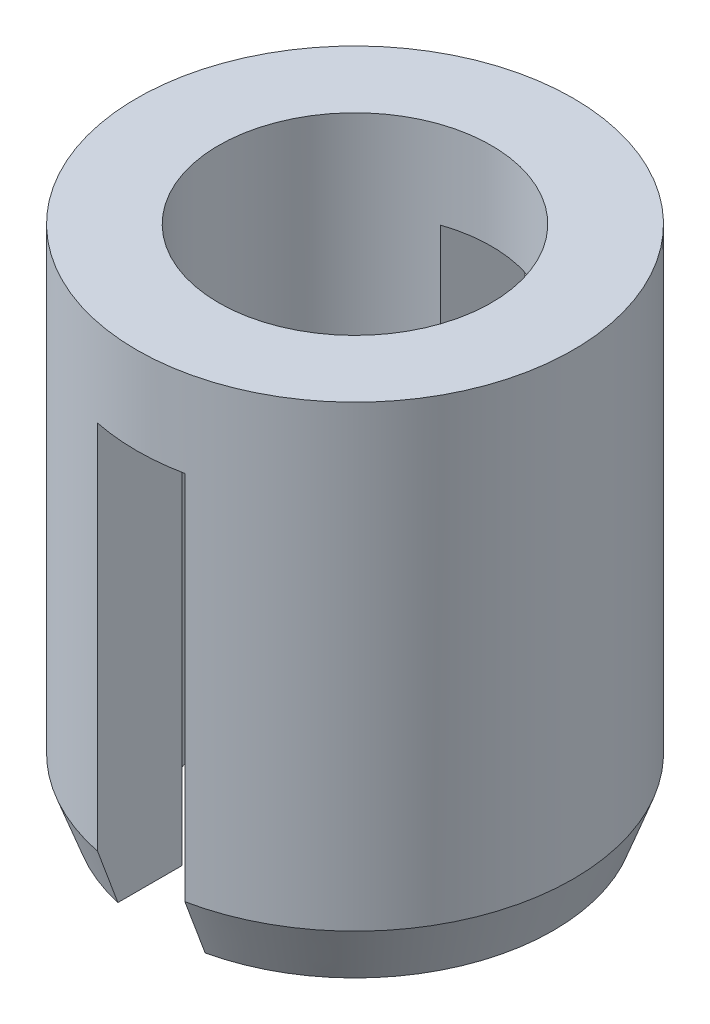
ISO-10303-21;
HEADER;
FILE_DESCRIPTION(('STEP AP214'),'2;1');
FILE_NAME('part.step','',(''),(''),'','','');
FILE_SCHEMA(('AUTOMOTIVE_DESIGN { 1 0 10303 214 1 1 1 1 }'));
ENDSEC;
DATA;
#1=APPLICATION_CONTEXT('core data for automotive mechanical design processes');
#2=APPLICATION_PROTOCOL_DEFINITION('international standard','automotive_design',2000,#1);
#3=PRODUCT_CONTEXT('',#1,'mechanical');
#4=PRODUCT('Part','Part','',(#3));
#5=PRODUCT_RELATED_PRODUCT_CATEGORY('part','',(#4));
#6=PRODUCT_DEFINITION_FORMATION('','',#4);
#7=PRODUCT_DEFINITION_CONTEXT('part definition',#1,'design');
#8=PRODUCT_DEFINITION('design','',#6,#7);
#9=PRODUCT_DEFINITION_SHAPE('','',#8);
#10=(LENGTH_UNIT() NAMED_UNIT(*) SI_UNIT(.MILLI.,.METRE.));
#11=(NAMED_UNIT(*) PLANE_ANGLE_UNIT() SI_UNIT($,.RADIAN.));
#12=(NAMED_UNIT(*) SI_UNIT($,.STERADIAN.) SOLID_ANGLE_UNIT());
#13=UNCERTAINTY_MEASURE_WITH_UNIT(LENGTH_MEASURE(1.E-05),#10,'distance_accuracy_value','');
#14=(GEOMETRIC_REPRESENTATION_CONTEXT(3) GLOBAL_UNCERTAINTY_ASSIGNED_CONTEXT((#13)) GLOBAL_UNIT_ASSIGNED_CONTEXT((#10,
#11,#12)) REPRESENTATION_CONTEXT('',''));
#15=CARTESIAN_POINT('',(0.,0.,0.));
#16=DIRECTION('',(0.,0.,1.));
#17=DIRECTION('',(1.,0.,0.));
#18=AXIS2_PLACEMENT_3D('',#15,#16,#17);
#19=CARTESIAN_POINT('',(-1.8180148828669,-4.7,0.));
#20=DIRECTION('',(0.,-1.,0.));
#21=DIRECTION('',(0.,0.,-1.));
#22=AXIS2_PLACEMENT_3D('',#19,#20,#21);
#23=PLANE('',#22);
#24=DIRECTION('',(0.,0.,1.));
#25=VECTOR('',#24,1.);
#26=CARTESIAN_POINT('',(0.400000000000018,-4.7,-2.0000000000002));
#27=LINE('',#26,#25);
#28=CARTESIAN_POINT('',(0.39999999999997,-4.7,-1.77346500228386));
#29=VERTEX_POINT('',#28);
#30=CARTESIAN_POINT('',(0.400000000000039,-4.7,-1.18427192823262));
#31=VERTEX_POINT('',#30);
#32=EDGE_CURVE('E141',#29,#31,#27,.T.);
#33=ORIENTED_EDGE('',*,*,#32,.F.);
#34=CARTESIAN_POINT('',(0.,-4.7,0.));
#35=DIRECTION('',(0.,1.,0.));
#36=DIRECTION('',(0.,0.,1.));
#37=AXIS2_PLACEMENT_3D('',#34,#35,#36);
#38=CIRCLE('',#37,1.8180148828669);
#39=CARTESIAN_POINT('',(0.400000000000005,-4.7,1.77346500228386));
#40=VERTEX_POINT('',#39);
#41=EDGE_CURVE('E198',#40,#29,#38,.T.);
#42=ORIENTED_EDGE('',*,*,#41,.F.);
#43=CARTESIAN_POINT('',(0.400000000000081,-4.7,1.18427192823251));
#44=VERTEX_POINT('',#43);
#45=EDGE_CURVE('E223',#44,#40,#27,.T.);
#46=ORIENTED_EDGE('',*,*,#45,.F.);
#47=CARTESIAN_POINT('',(0.,-4.7,0.));
#48=DIRECTION('',(0.,1.,0.));
#49=DIRECTION('',(0.,0.,1.));
#50=AXIS2_PLACEMENT_3D('',#47,#48,#49);
#51=CIRCLE('',#50,1.25);
#52=EDGE_CURVE('E194',#44,#31,#51,.T.);
#53=ORIENTED_EDGE('',*,*,#52,.T.);
#54=EDGE_LOOP('',(#33,#42,#46,#53));
#55=FACE_BOUND('',#54,.T.);
#56=ADVANCED_FACE('F34',(#55),#23,.T.);
#57=CARTESIAN_POINT('',(0.,-4.2,0.));
#58=DIRECTION('',(0.,1.,0.));
#59=DIRECTION('',(0.,0.,1.));
#60=AXIS2_PLACEMENT_3D('',#57,#58,#59);
#61=CONICAL_SURFACE('',#60,2.,0.349065850398867);
#62=CARTESIAN_POINT('',(0.39999999999997,-1.9641774451377,-2.78519616947262));
#63=CARTESIAN_POINT('',(0.400000000000008,-2.18155976175812,-2.70526019832978));
#64=CARTESIAN_POINT('',(0.400000000000017,-2.39892172738306,-2.62526876087106));
#65=CARTESIAN_POINT('',(0.40000000000002,-2.83358517004386,-2.46512437552703));
#66=CARTESIAN_POINT('',(0.400000000000013,-3.0508866473154,-2.38497142828135));
#67=CARTESIAN_POINT('',(0.400000000000024,-3.48540398290253,-2.22445542344387));
#68=CARTESIAN_POINT('',(0.400000000000042,-3.7026198437717,-2.14409237276678));
#69=CARTESIAN_POINT('',(0.399999999999994,-4.13694286912748,-1.98306994318263));
#70=CARTESIAN_POINT('',(0.399999999999928,-4.35405003312669,-1.90241056296009));
#71=CARTESIAN_POINT('',(0.399999999999928,-4.78811531323446,-1.74065948129895));
#72=CARTESIAN_POINT('',(0.399999999999994,-5.0050734216019,-1.65956775907849));
#73=CARTESIAN_POINT('',(0.400000000000042,-5.43874455019169,-1.49673695753438));
#74=CARTESIAN_POINT('',(0.400000000000023,-5.65545757293101,-1.41499788492909));
#75=CARTESIAN_POINT('',(0.400000000000016,-5.98022552765836,-1.29158018300326));
#76=CARTESIAN_POINT('',(0.400000000000017,-6.08843372247734,-1.25030514625839));
#77=CARTESIAN_POINT('',(0.400000000000019,-6.30470931409476,-1.16738939752328));
#78=CARTESIAN_POINT('',(0.400000000000019,-6.41277671163775,-1.12574868747587));
#79=CARTESIAN_POINT('',(0.400000000000017,-6.62872492142234,-1.0419732092528));
#80=CARTESIAN_POINT('',(0.400000000000015,-6.7366057268173,-0.999838423371511));
#81=CARTESIAN_POINT('',(0.400000000000021,-6.95207672413517,-0.914827239364401));
#82=CARTESIAN_POINT('',(0.400000000000031,-7.05966691062808,-0.871950827491156));
#83=CARTESIAN_POINT('',(0.400000000000053,-7.16705971625438,-0.828579865409643));
#84=B_SPLINE_CURVE_WITH_KNOTS('',3,(#62,#63,#64,#65,#66,#67,#68,#69,#70,#71,#72,#73,#74,#75,#76,
#77,#78,#79,#80,#81,#82,#83),.UNSPECIFIED.,.F.,.F.,(4,2,2,2,2,2,2,2,2,2,4),(0.,
0.694840671776615,1.3896785971493,2.0844939355479,2.77931236213644,3.47416449398758,
4.16900942391278,4.51644779308021,4.86388431742057,5.21133333072998,5.55878879157342),.UNSPECIFIED.);
#85=CARTESIAN_POINT('',(0.399999999999831,-4.2,-1.95959179422654));
#86=VERTEX_POINT('',#85);
#87=EDGE_CURVE('E183',#86,#29,#84,.T.);
#88=ORIENTED_EDGE('',*,*,#87,.F.);
#89=CARTESIAN_POINT('',(0.,-4.2,0.));
#90=DIRECTION('',(0.,1.,0.));
#91=DIRECTION('',(0.,0.,1.));
#92=AXIS2_PLACEMENT_3D('',#89,#90,#91);
#93=CIRCLE('',#92,2.);
#94=CARTESIAN_POINT('',(0.399999999999998,-4.2,1.95959179422654));
#95=VERTEX_POINT('',#94);
#96=EDGE_CURVE('E203',#95,#86,#93,.T.);
#97=ORIENTED_EDGE('',*,*,#96,.F.);
#98=CARTESIAN_POINT('',(0.39999999999997,-7.16705971625438,0.828579865409684));
#99=CARTESIAN_POINT('',(0.4,-7.06109378190793,0.871375614499715));
#100=CARTESIAN_POINT('',(0.400000000000013,-6.95493518535811,0.9136887407043));
#101=CARTESIAN_POINT('',(0.400000000000023,-6.74233360263579,0.997589476860975));
#102=CARTESIAN_POINT('',(0.40000000000002,-6.63589062169458,1.03917710005426));
#103=CARTESIAN_POINT('',(0.400000000000016,-6.42282142624213,1.12186651453775));
#104=CARTESIAN_POINT('',(0.400000000000016,-6.31619521894113,1.16296832446576));
#105=CARTESIAN_POINT('',(0.40000000000002,-6.10280397521812,1.24481151205341));
#106=CARTESIAN_POINT('',(0.400000000000023,-5.99603893806842,1.28555288781499));
#107=CARTESIAN_POINT('',(0.40000000000003,-5.66985105428641,1.40956119862517));
#108=CARTESIAN_POINT('',(0.40000000000003,-5.45026580464136,1.49240065053542));
#109=CARTESIAN_POINT('',(0.400000000000006,-5.01084014984897,1.65741237905836));
#110=CARTESIAN_POINT('',(0.399999999999983,-4.79099973949926,1.73958464178483));
#111=CARTESIAN_POINT('',(0.399999999999985,-4.35404122078509,1.90241382736396));
#112=CARTESIAN_POINT('',(0.400000000000009,-4.13692524845718,1.98307648458457));
#113=CARTESIAN_POINT('',(0.400000000000027,-3.70258354955549,2.14410582000742));
#114=CARTESIAN_POINT('',(0.40000000000002,-3.48535782294182,2.22447249810201));
#115=CARTESIAN_POINT('',(0.400000000000016,-3.05083938657309,2.38498886427169));
#116=CARTESIAN_POINT('',(0.400000000000019,-2.83354668100187,2.46513856367601));
#117=CARTESIAN_POINT('',(0.400000000000018,-2.39890191531771,2.62527605306153));
#118=CARTESIAN_POINT('',(0.400000000000013,-2.18154985527856,2.70526384324297));
#119=CARTESIAN_POINT('',(0.399999999999998,-1.9641774451377,2.78519616947244));
#120=B_SPLINE_CURVE_WITH_KNOTS('',3,(#98,#99,#100,#101,#102,#103,#104,#105,#106,#107,#108,#109,
#110,#111,#112,#113,#114,#115,#116,#117,#118,#119),.UNSPECIFIED.,.F.,.F.,(4,2,2,2,2,2,2,2,2,2,
4),(0.,0.342840273301402,0.685674282846857,1.02849509689675,1.37131771518423,2.07538977191412,
2.77947644513146,3.47432306538127,4.16916993831257,4.86397980266464,5.55878880726069),.UNSPECIFIED.);
#121=EDGE_CURVE('E122',#40,#95,#120,.T.);
#122=ORIENTED_EDGE('',*,*,#121,.F.);
#123=ORIENTED_EDGE('',*,*,#41,.T.);
#124=EDGE_LOOP('',(#88,#97,#122,#123));
#125=FACE_BOUND('',#124,.T.);
#126=ADVANCED_FACE('F244',(#125),#61,.T.);
#127=DIRECTION('',(0.,0.,1.));
#128=VECTOR('',#127,1.);
#129=CARTESIAN_POINT('',(-0.400000000000018,-4.7,-2.0000000000002));
#130=LINE('',#129,#128);
#131=CARTESIAN_POINT('',(-0.400000000000074,-4.7,1.18427192823237));
#132=VERTEX_POINT('',#131);
#133=CARTESIAN_POINT('',(-0.400000000000129,-4.7,1.7734650022838));
#134=VERTEX_POINT('',#133);
#135=EDGE_CURVE('E128',#132,#134,#130,.T.);
#136=ORIENTED_EDGE('',*,*,#135,.T.);
#137=CARTESIAN_POINT('',(-0.400000000000095,-4.7,-1.77346500228394));
#138=VERTEX_POINT('',#137);
#139=EDGE_CURVE('E197',#138,#134,#38,.T.);
#140=ORIENTED_EDGE('',*,*,#139,.F.);
#141=CARTESIAN_POINT('',(-0.400000000000039,-4.7,-1.18427192823266));
#142=VERTEX_POINT('',#141);
#143=EDGE_CURVE('E226',#138,#142,#130,.T.);
#144=ORIENTED_EDGE('',*,*,#143,.T.);
#145=EDGE_CURVE('E193',#142,#132,#51,.T.);
#146=ORIENTED_EDGE('',*,*,#145,.T.);
#147=EDGE_LOOP('',(#136,#140,#144,#146));
#148=FACE_BOUND('',#147,.T.);
#149=ADVANCED_FACE('F36',(#148),#23,.T.);
#150=CARTESIAN_POINT('',(0.,0.,0.));
#151=DIRECTION('',(0.,1.,0.));
#152=DIRECTION('',(0.,0.,1.));
#153=AXIS2_PLACEMENT_3D('',#150,#151,#152);
#154=PLANE('',#153);
#155=CARTESIAN_POINT('',(0.,0.,0.));
#156=DIRECTION('',(0.,1.,0.));
#157=DIRECTION('',(0.,0.,1.));
#158=AXIS2_PLACEMENT_3D('',#155,#156,#157);
#159=CIRCLE('',#158,1.24999999999999);
#160=CARTESIAN_POINT('',(0.,0.,1.24999999999999));
#161=VERTEX_POINT('',#160);
#162=EDGE_CURVE('E190',#161,#161,#159,.T.);
#163=ORIENTED_EDGE('',*,*,#162,.F.);
#164=EDGE_LOOP('',(#163));
#165=FACE_BOUND('',#164,.T.);
#166=CARTESIAN_POINT('',(0.,0.,0.));
#167=DIRECTION('',(0.,1.,0.));
#168=DIRECTION('',(0.,0.,1.));
#169=AXIS2_PLACEMENT_3D('',#166,#167,#168);
#170=CIRCLE('',#169,2.);
#171=CARTESIAN_POINT('',(0.,0.,2.));
#172=VERTEX_POINT('',#171);
#173=EDGE_CURVE('E204',#172,#172,#170,.T.);
#174=ORIENTED_EDGE('',*,*,#173,.T.);
#175=EDGE_LOOP('',(#174));
#176=FACE_BOUND('',#175,.T.);
#177=ADVANCED_FACE('F250',(#165,#176),#154,.T.);
#178=CARTESIAN_POINT('',(0.,-4.7,0.));
#179=DIRECTION('',(0.,1.,0.));
#180=DIRECTION('',(0.,0.,1.));
#181=AXIS2_PLACEMENT_3D('',#178,#179,#180);
#182=CYLINDRICAL_SURFACE('',#181,2.);
#183=DIRECTION('',(0.,1.,0.));
#184=VECTOR('',#183,1.);
#185=CARTESIAN_POINT('',(-0.39999999999997,-4.7,1.95959179422631));
#186=LINE('',#185,#184);
#187=CARTESIAN_POINT('',(-0.39999999999997,-0.799999999999995,1.95959179422631));
#188=VERTEX_POINT('',#187);
#189=CARTESIAN_POINT('',(-0.39999999999997,-4.2,1.95959179422631));
#190=VERTEX_POINT('',#189);
#191=EDGE_CURVE('E139',#188,#190,#186,.F.);
#192=ORIENTED_EDGE('',*,*,#191,.F.);
#193=CARTESIAN_POINT('',(0.,-0.799999999999995,0.));
#194=DIRECTION('',(0.,1.,0.));
#195=DIRECTION('',(0.,0.,1.));
#196=AXIS2_PLACEMENT_3D('',#193,#194,#195);
#197=CIRCLE('',#196,2.);
#198=CARTESIAN_POINT('',(0.399999999999998,-0.799999999999995,1.95959179422654));
#199=VERTEX_POINT('',#198);
#200=EDGE_CURVE('E137',#199,#188,#197,.F.);
#201=ORIENTED_EDGE('',*,*,#200,.F.);
#202=DIRECTION('',(0.,1.,0.));
#203=VECTOR('',#202,1.);
#204=CARTESIAN_POINT('',(0.399999999999998,-4.7,1.95959179422654));
#205=LINE('',#204,#203);
#206=EDGE_CURVE('E175',#95,#199,#205,.T.);
#207=ORIENTED_EDGE('',*,*,#206,.F.);
#208=ORIENTED_EDGE('',*,*,#96,.T.);
#209=DIRECTION('',(0.,1.,0.));
#210=VECTOR('',#209,1.);
#211=CARTESIAN_POINT('',(0.399999999999831,-4.7,-1.95959179422654));
#212=LINE('',#211,#210);
#213=CARTESIAN_POINT('',(0.399999999999831,-0.799999999999995,-1.95959179422654));
#214=VERTEX_POINT('',#213);
#215=EDGE_CURVE('E135',#214,#86,#212,.F.);
#216=ORIENTED_EDGE('',*,*,#215,.F.);
#217=CARTESIAN_POINT('',(-0.400000000000032,-0.799999999999995,-1.95959179422658));
#218=VERTEX_POINT('',#217);
#219=EDGE_CURVE('E125',#218,#214,#197,.F.);
#220=ORIENTED_EDGE('',*,*,#219,.F.);
#221=DIRECTION('',(0.,1.,0.));
#222=VECTOR('',#221,1.);
#223=CARTESIAN_POINT('',(-0.400000000000032,-4.7,-1.95959179422658));
#224=LINE('',#223,#222);
#225=CARTESIAN_POINT('',(-0.400000000000032,-4.2,-1.95959179422658));
#226=VERTEX_POINT('',#225);
#227=EDGE_CURVE('E111',#226,#218,#224,.T.);
#228=ORIENTED_EDGE('',*,*,#227,.F.);
#229=EDGE_CURVE('E201',#226,#190,#93,.T.);
#230=ORIENTED_EDGE('',*,*,#229,.T.);
#231=EDGE_LOOP('',(#192,#201,#207,#208,#216,#220,#228,#230));
#232=FACE_BOUND('',#231,.T.);
#233=ORIENTED_EDGE('',*,*,#173,.F.);
#234=EDGE_LOOP('',(#233));
#235=FACE_BOUND('',#234,.T.);
#236=ADVANCED_FACE('F132',(#232,#235),#182,.T.);
#237=CARTESIAN_POINT('',(-0.399999999999928,-7.16705971625438,-0.828579865409768));
#238=CARTESIAN_POINT('',(-0.399999999999986,-7.06109378190792,-0.871375614499757));
#239=CARTESIAN_POINT('',(-0.40000000000001,-6.9549351853581,-0.913688740704317));
#240=CARTESIAN_POINT('',(-0.400000000000026,-6.74233360263579,-0.997589476860967));
#241=CARTESIAN_POINT('',(-0.40000000000002,-6.63589062169458,-1.03917710005425));
#242=CARTESIAN_POINT('',(-0.400000000000016,-6.42282142624214,-1.12186651453776));
#243=CARTESIAN_POINT('',(-0.40000000000002,-6.31619521894116,-1.16296832446578));
#244=CARTESIAN_POINT('',(-0.400000000000016,-6.10280397521814,-1.24481151205338));
#245=CARTESIAN_POINT('',(-0.400000000000009,-5.99603893806842,-1.28555288781489));
#246=CARTESIAN_POINT('',(-0.399999999999995,-5.66985105428637,-1.409561198625));
#247=CARTESIAN_POINT('',(-0.399999999999998,-5.45026580464133,-1.49240065053534));
#248=CARTESIAN_POINT('',(-0.400000000000038,-5.01084014984897,-1.65741237905845));
#249=CARTESIAN_POINT('',(-0.400000000000076,-4.79099973949928,-1.739584641785));
#250=CARTESIAN_POINT('',(-0.400000000000072,-4.35404122078509,-1.90241382736412));
#251=CARTESIAN_POINT('',(-0.400000000000033,-4.13692524845715,-1.98307648458463));
#252=CARTESIAN_POINT('',(-0.400000000000004,-3.70258354955543,-2.1441058200074));
#253=CARTESIAN_POINT('',(-0.400000000000014,-3.48535782294177,-2.22447249810202));
#254=CARTESIAN_POINT('',(-0.400000000000022,-3.05083938657304,-2.38498886427171));
#255=CARTESIAN_POINT('',(-0.40000000000002,-2.83354668100182,-2.46513856367602));
#256=CARTESIAN_POINT('',(-0.400000000000016,-2.39890191531767,-2.62527605306156));
#257=CARTESIAN_POINT('',(-0.400000000000014,-2.18154985527853,-2.70526384324302));
#258=CARTESIAN_POINT('',(-0.400000000000018,-1.9641774451377,-2.78519616947258));
#259=B_SPLINE_CURVE_WITH_KNOTS('',3,(#237,#238,#239,#240,#241,#242,#243,#244,#245,#246,#247,
#248,#249,#250,#251,#252,#253,#254,#255,#256,#257,#258),.UNSPECIFIED.,.F.,.F.,(4,2,2,2,2,2,2,2,
2,2,4),(0.,0.342840273301383,0.685674282846818,1.02849509689669,1.37131771518416,
2.0753897719141,2.77947644513149,3.47432306538129,4.16916993831259,4.86397980266466,
5.5587888072607),.UNSPECIFIED.);
#260=EDGE_CURVE('E117',#138,#226,#259,.T.);
#261=ORIENTED_EDGE('',*,*,#260,.F.);
#262=ORIENTED_EDGE('',*,*,#139,.T.);
#263=CARTESIAN_POINT('',(-0.399999999999998,-1.9641774451377,2.78519616947244));
#264=CARTESIAN_POINT('',(-0.400000000000018,-2.18155976175816,2.7052601983297));
#265=CARTESIAN_POINT('',(-0.40000000000002,-2.39892172738311,2.62526876087103));
#266=CARTESIAN_POINT('',(-0.400000000000017,-2.83358517004391,2.46512437552703));
#267=CARTESIAN_POINT('',(-0.400000000000012,-3.05088664731544,2.38497142828133));
#268=CARTESIAN_POINT('',(-0.400000000000025,-3.48540398290257,2.22445542344385));
#269=CARTESIAN_POINT('',(-0.400000000000042,-3.70261984377175,2.14409237276679));
#270=CARTESIAN_POINT('',(-0.399999999999994,-4.13694286912751,1.9830699431826));
#271=CARTESIAN_POINT('',(-0.399999999999928,-4.3540500331267,1.90241056296));
#272=CARTESIAN_POINT('',(-0.399999999999928,-4.78811531323445,1.74065948129887));
#273=CARTESIAN_POINT('',(-0.399999999999995,-5.00507342160191,1.65956775907847));
#274=CARTESIAN_POINT('',(-0.400000000000042,-5.43874455019171,1.4967369575344));
#275=CARTESIAN_POINT('',(-0.400000000000022,-5.65545757293101,1.41499788492909));
#276=CARTESIAN_POINT('',(-0.400000000000016,-5.98022552765835,1.29158018300326));
#277=CARTESIAN_POINT('',(-0.400000000000018,-6.08843372247733,1.25030514625839));
#278=CARTESIAN_POINT('',(-0.400000000000018,-6.30470931409474,1.16738939752329));
#279=CARTESIAN_POINT('',(-0.400000000000017,-6.41277671163774,1.12574868747588));
#280=CARTESIAN_POINT('',(-0.400000000000019,-6.62872492142232,1.04197320925281));
#281=CARTESIAN_POINT('',(-0.400000000000022,-6.73660572681728,0.999838423371512));
#282=CARTESIAN_POINT('',(-0.400000000000014,-6.95207672413514,0.91482723936442));
#283=CARTESIAN_POINT('',(-0.400000000000003,-7.05966691062806,0.871950827491199));
#284=CARTESIAN_POINT('',(-0.399999999999977,-7.16705971625438,0.82857986540974));
#285=B_SPLINE_CURVE_WITH_KNOTS('',3,(#263,#264,#265,#266,#267,#268,#269,#270,#271,#272,#273,
#274,#275,#276,#277,#278,#279,#280,#281,#282,#283,#284),.UNSPECIFIED.,.F.,.F.,(4,2,2,2,2,2,2,2,
2,2,4),(0.,0.694840671776607,1.38967859714929,2.08449393554788,2.77931236213641,
3.47416449398753,4.16900942391272,4.51644779308014,4.86388431742049,5.21133333072989,
5.55878879157332),.UNSPECIFIED.);
#286=EDGE_CURVE('E136',#190,#134,#285,.T.);
#287=ORIENTED_EDGE('',*,*,#286,.F.);
#288=ORIENTED_EDGE('',*,*,#229,.F.);
#289=EDGE_LOOP('',(#261,#262,#287,#288));
#290=FACE_BOUND('',#289,.T.);
#291=ADVANCED_FACE('F152',(#290),#61,.T.);
#292=CARTESIAN_POINT('',(0.,0.,0.));
#293=DIRECTION('',(0.,1.,0.));
#294=DIRECTION('',(0.,0.,1.));
#295=AXIS2_PLACEMENT_3D('',#292,#293,#294);
#296=CYLINDRICAL_SURFACE('',#295,1.24999999999999);
#297=CARTESIAN_POINT('',(0.,-0.799999999999995,0.));
#298=DIRECTION('',(0.,1.,0.));
#299=DIRECTION('',(0.,0.,1.));
#300=AXIS2_PLACEMENT_3D('',#297,#298,#299);
#301=CIRCLE('',#300,1.24999999999999);
#302=CARTESIAN_POINT('',(-0.400000000000039,-0.799999999999995,-1.18427192823266));
#303=VERTEX_POINT('',#302);
#304=CARTESIAN_POINT('',(0.400000000000039,-0.799999999999995,-1.18427192823262));
#305=VERTEX_POINT('',#304);
#306=EDGE_CURVE('E127',#303,#305,#301,.F.);
#307=ORIENTED_EDGE('',*,*,#306,.T.);
#308=DIRECTION('',(0.,1.,0.));
#309=VECTOR('',#308,1.);
#310=CARTESIAN_POINT('',(0.400000000000039,0.,-1.18427192823262));
#311=LINE('',#310,#309);
#312=EDGE_CURVE('E11',#305,#31,#311,.F.);
#313=ORIENTED_EDGE('',*,*,#312,.T.);
#314=ORIENTED_EDGE('',*,*,#52,.F.);
#315=DIRECTION('',(0.,1.,0.));
#316=VECTOR('',#315,1.);
#317=CARTESIAN_POINT('',(0.400000000000081,0.,1.18427192823251));
#318=LINE('',#317,#316);
#319=CARTESIAN_POINT('',(0.400000000000081,-0.799999999999995,1.18427192823251));
#320=VERTEX_POINT('',#319);
#321=EDGE_CURVE('E213',#44,#320,#318,.T.);
#322=ORIENTED_EDGE('',*,*,#321,.T.);
#323=CARTESIAN_POINT('',(-0.400000000000074,-0.799999999999995,1.18427192823237));
#324=VERTEX_POINT('',#323);
#325=EDGE_CURVE('E207',#320,#324,#301,.F.);
#326=ORIENTED_EDGE('',*,*,#325,.T.);
#327=DIRECTION('',(0.,1.,0.));
#328=VECTOR('',#327,1.);
#329=CARTESIAN_POINT('',(-0.400000000000074,0.,1.18427192823237));
#330=LINE('',#329,#328);
#331=EDGE_CURVE('E210',#324,#132,#330,.F.);
#332=ORIENTED_EDGE('',*,*,#331,.T.);
#333=ORIENTED_EDGE('',*,*,#145,.F.);
#334=DIRECTION('',(0.,1.,0.));
#335=VECTOR('',#334,1.);
#336=CARTESIAN_POINT('',(-0.400000000000039,0.,-1.18427192823266));
#337=LINE('',#336,#335);
#338=EDGE_CURVE('E42',#142,#303,#337,.T.);
#339=ORIENTED_EDGE('',*,*,#338,.T.);
#340=EDGE_LOOP('',(#307,#313,#314,#322,#326,#332,#333,#339));
#341=FACE_BOUND('',#340,.T.);
#342=ORIENTED_EDGE('',*,*,#162,.T.);
#343=EDGE_LOOP('',(#342));
#344=FACE_BOUND('',#343,.T.);
#345=ADVANCED_FACE('F181',(#341,#344),#296,.F.);
#346=CARTESIAN_POINT('',(0.400000000000018,-0.799999999999995,-2.0000000000002));
#347=DIRECTION('',(0.,1.,0.));
#348=DIRECTION('',(0.,0.,1.));
#349=AXIS2_PLACEMENT_3D('',#346,#347,#348);
#350=PLANE('',#349);
#351=ORIENTED_EDGE('',*,*,#200,.T.);
#352=DIRECTION('',(0.,0.,1.));
#353=VECTOR('',#352,1.);
#354=CARTESIAN_POINT('',(-0.400000000000018,-0.799999999999995,-2.0000000000002));
#355=LINE('',#354,#353);
#356=EDGE_CURVE('E57',#324,#188,#355,.T.);
#357=ORIENTED_EDGE('',*,*,#356,.F.);
#358=ORIENTED_EDGE('',*,*,#325,.F.);
#359=DIRECTION('',(0.,0.,1.));
#360=VECTOR('',#359,1.);
#361=CARTESIAN_POINT('',(0.400000000000018,-0.799999999999995,-2.0000000000002));
#362=LINE('',#361,#360);
#363=EDGE_CURVE('E143',#320,#199,#362,.T.);
#364=ORIENTED_EDGE('',*,*,#363,.T.);
#365=EDGE_LOOP('',(#351,#357,#358,#364));
#366=FACE_BOUND('',#365,.T.);
#367=ADVANCED_FACE('F161',(#366),#350,.F.);
#368=CARTESIAN_POINT('',(-0.400000000000018,-0.799999999999995,-2.0000000000002));
#369=DIRECTION('',(-1.,0.,0.));
#370=DIRECTION('',(0.,-1.,0.));
#371=AXIS2_PLACEMENT_3D('',#368,#369,#370);
#372=PLANE('',#371);
#373=ORIENTED_EDGE('',*,*,#191,.T.);
#374=ORIENTED_EDGE('',*,*,#286,.T.);
#375=ORIENTED_EDGE('',*,*,#135,.F.);
#376=ORIENTED_EDGE('',*,*,#331,.F.);
#377=ORIENTED_EDGE('',*,*,#356,.T.);
#378=EDGE_LOOP('',(#373,#374,#375,#376,#377));
#379=FACE_BOUND('',#378,.T.);
#380=ADVANCED_FACE('F156',(#379),#372,.F.);
#381=CARTESIAN_POINT('',(0.400000000000018,-0.799999999999995,-2.0000000000002));
#382=DIRECTION('',(1.,0.,0.));
#383=DIRECTION('',(0.,1.,0.));
#384=AXIS2_PLACEMENT_3D('',#381,#382,#383);
#385=PLANE('',#384);
#386=ORIENTED_EDGE('',*,*,#206,.T.);
#387=ORIENTED_EDGE('',*,*,#363,.F.);
#388=ORIENTED_EDGE('',*,*,#321,.F.);
#389=ORIENTED_EDGE('',*,*,#45,.T.);
#390=ORIENTED_EDGE('',*,*,#121,.T.);
#391=EDGE_LOOP('',(#386,#387,#388,#389,#390));
#392=FACE_BOUND('',#391,.T.);
#393=ADVANCED_FACE('F160',(#392),#385,.F.);
#394=ORIENTED_EDGE('',*,*,#215,.T.);
#395=ORIENTED_EDGE('',*,*,#87,.T.);
#396=ORIENTED_EDGE('',*,*,#32,.T.);
#397=ORIENTED_EDGE('',*,*,#312,.F.);
#398=EDGE_CURVE('E49',#214,#305,#362,.T.);
#399=ORIENTED_EDGE('',*,*,#398,.F.);
#400=EDGE_LOOP('',(#394,#395,#396,#397,#399));
#401=FACE_BOUND('',#400,.T.);
#402=ADVANCED_FACE('F177',(#401),#385,.F.);
#403=ORIENTED_EDGE('',*,*,#227,.T.);
#404=EDGE_CURVE('E114',#218,#303,#355,.T.);
#405=ORIENTED_EDGE('',*,*,#404,.T.);
#406=ORIENTED_EDGE('',*,*,#338,.F.);
#407=ORIENTED_EDGE('',*,*,#143,.F.);
#408=ORIENTED_EDGE('',*,*,#260,.T.);
#409=EDGE_LOOP('',(#403,#405,#406,#407,#408));
#410=FACE_BOUND('',#409,.T.);
#411=ADVANCED_FACE('F113',(#410),#372,.F.);
#412=ORIENTED_EDGE('',*,*,#219,.T.);
#413=ORIENTED_EDGE('',*,*,#398,.T.);
#414=ORIENTED_EDGE('',*,*,#306,.F.);
#415=ORIENTED_EDGE('',*,*,#404,.F.);
#416=EDGE_LOOP('',(#412,#413,#414,#415));
#417=FACE_BOUND('',#416,.T.);
#418=ADVANCED_FACE('F124',(#417),#350,.F.);
#419=CLOSED_SHELL('',(#56,#126,#149,#177,#236,#291,#345,#367,#380,#393,#402,#411,#418));
#420=MANIFOLD_SOLID_BREP('B2',#419);
#421=ADVANCED_BREP_SHAPE_REPRESENTATION('',(#18,#420),#14);
#422=SHAPE_DEFINITION_REPRESENTATION(#9,#421);
ENDSEC;
END-ISO-10303-21;
